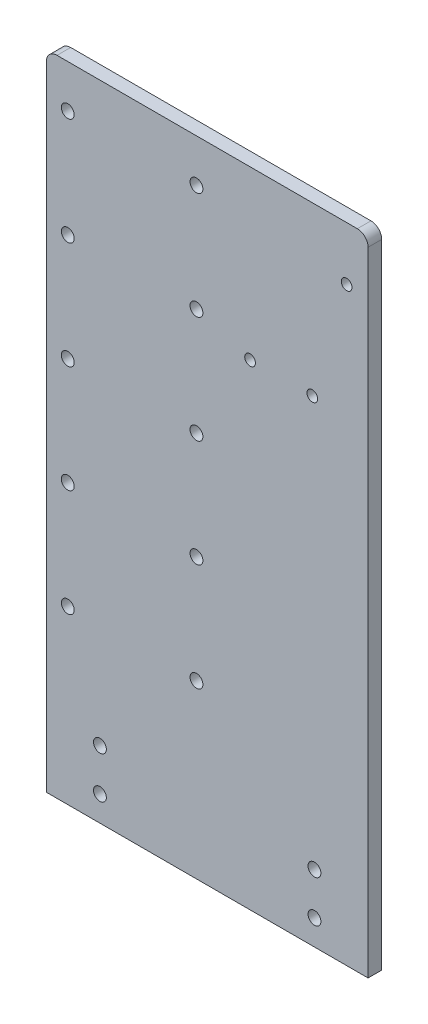
ISO-10303-21;
HEADER;
FILE_DESCRIPTION(('STEP AP214'),'2;1');
FILE_NAME('part.step','',(''),(''),'','','');
FILE_SCHEMA(('AUTOMOTIVE_DESIGN { 1 0 10303 214 1 1 1 1 }'));
ENDSEC;
DATA;
#1=APPLICATION_CONTEXT('core data for automotive mechanical design processes');
#2=APPLICATION_PROTOCOL_DEFINITION('international standard','automotive_design',2000,#1);
#3=PRODUCT_CONTEXT('',#1,'mechanical');
#4=PRODUCT('Part','Part','',(#3));
#5=PRODUCT_RELATED_PRODUCT_CATEGORY('part','',(#4));
#6=PRODUCT_DEFINITION_FORMATION('','',#4);
#7=PRODUCT_DEFINITION_CONTEXT('part definition',#1,'design');
#8=PRODUCT_DEFINITION('design','',#6,#7);
#9=PRODUCT_DEFINITION_SHAPE('','',#8);
#10=(LENGTH_UNIT() NAMED_UNIT(*) SI_UNIT(.MILLI.,.METRE.));
#11=(NAMED_UNIT(*) PLANE_ANGLE_UNIT() SI_UNIT($,.RADIAN.));
#12=(NAMED_UNIT(*) SI_UNIT($,.STERADIAN.) SOLID_ANGLE_UNIT());
#13=UNCERTAINTY_MEASURE_WITH_UNIT(LENGTH_MEASURE(1.E-05),#10,'distance_accuracy_value','');
#14=(GEOMETRIC_REPRESENTATION_CONTEXT(3) GLOBAL_UNCERTAINTY_ASSIGNED_CONTEXT((#13)) GLOBAL_UNIT_ASSIGNED_CONTEXT((#10,
#11,#12)) REPRESENTATION_CONTEXT('',''));
#15=CARTESIAN_POINT('',(0.,0.,0.));
#16=DIRECTION('',(0.,0.,1.));
#17=DIRECTION('',(1.,0.,0.));
#18=AXIS2_PLACEMENT_3D('',#15,#16,#17);
#19=CARTESIAN_POINT('',(-52.5112959769321,81.6237761299463,6.35));
#20=DIRECTION('',(1.,0.,0.));
#21=DIRECTION('',(0.,1.,0.));
#22=AXIS2_PLACEMENT_3D('',#19,#20,#21);
#23=PLANE('',#22);
#24=DIRECTION('',(0.,-1.,0.));
#25=VECTOR('',#24,1.);
#26=CARTESIAN_POINT('',(-52.5112959769321,81.6237761299463,6.35));
#27=LINE('',#26,#25);
#28=CARTESIAN_POINT('',(-52.5112959769321,76.6237761299463,6.35));
#29=VERTEX_POINT('',#28);
#30=CARTESIAN_POINT('',(-52.5112959769321,-218.376223870054,6.35));
#31=VERTEX_POINT('',#30);
#32=EDGE_CURVE('E85',#29,#31,#27,.T.);
#33=ORIENTED_EDGE('',*,*,#32,.F.);
#34=DIRECTION('',(0.,0.,-1.));
#35=VECTOR('',#34,1.);
#36=CARTESIAN_POINT('',(-52.5112959769321,76.6237761299463,6.35));
#37=LINE('',#36,#35);
#38=CARTESIAN_POINT('',(-52.5112959769321,76.6237761299463,0.));
#39=VERTEX_POINT('',#38);
#40=EDGE_CURVE('E11',#29,#39,#37,.T.);
#41=ORIENTED_EDGE('',*,*,#40,.T.);
#42=DIRECTION('',(0.,-1.,0.));
#43=VECTOR('',#42,1.);
#44=CARTESIAN_POINT('',(-52.5112959769321,81.6237761299463,0.));
#45=LINE('',#44,#43);
#46=CARTESIAN_POINT('',(-52.5112959769321,-218.376223870054,0.));
#47=VERTEX_POINT('',#46);
#48=EDGE_CURVE('E104',#39,#47,#45,.T.);
#49=ORIENTED_EDGE('',*,*,#48,.T.);
#50=DIRECTION('',(0.,0.,-1.));
#51=VECTOR('',#50,1.);
#52=CARTESIAN_POINT('',(-52.5112959769321,-218.376223870054,6.35));
#53=LINE('',#52,#51);
#54=EDGE_CURVE('E98',#31,#47,#53,.T.);
#55=ORIENTED_EDGE('',*,*,#54,.F.);
#56=EDGE_LOOP('',(#33,#41,#49,#55));
#57=FACE_BOUND('',#56,.T.);
#58=ADVANCED_FACE('F32',(#57),#23,.F.);
#59=CARTESIAN_POINT('',(-52.5112959769321,-218.376223870054,6.35));
#60=DIRECTION('',(0.,1.,0.));
#61=DIRECTION('',(0.,0.,1.));
#62=AXIS2_PLACEMENT_3D('',#59,#60,#61);
#63=PLANE('',#62);
#64=DIRECTION('',(1.,0.,0.));
#65=VECTOR('',#64,1.);
#66=CARTESIAN_POINT('',(-52.5112959769321,-218.376223870054,0.));
#67=LINE('',#66,#65);
#68=CARTESIAN_POINT('',(97.4887040230679,-218.376223870054,0.));
#69=VERTEX_POINT('',#68);
#70=EDGE_CURVE('E137',#47,#69,#67,.T.);
#71=ORIENTED_EDGE('',*,*,#70,.T.);
#72=DIRECTION('',(0.,0.,-1.));
#73=VECTOR('',#72,1.);
#74=CARTESIAN_POINT('',(97.4887040230679,-218.376223870054,6.35));
#75=LINE('',#74,#73);
#76=CARTESIAN_POINT('',(97.4887040230679,-218.376223870054,6.35));
#77=VERTEX_POINT('',#76);
#78=EDGE_CURVE('E100',#77,#69,#75,.T.);
#79=ORIENTED_EDGE('',*,*,#78,.F.);
#80=DIRECTION('',(1.,0.,0.));
#81=VECTOR('',#80,1.);
#82=CARTESIAN_POINT('',(-52.5112959769321,-218.376223870054,6.35));
#83=LINE('',#82,#81);
#84=EDGE_CURVE('E88',#31,#77,#83,.T.);
#85=ORIENTED_EDGE('',*,*,#84,.F.);
#86=ORIENTED_EDGE('',*,*,#54,.T.);
#87=EDGE_LOOP('',(#71,#79,#85,#86));
#88=FACE_BOUND('',#87,.T.);
#89=ADVANCED_FACE('F97',(#88),#63,.F.);
#90=CARTESIAN_POINT('',(97.4887040230678,81.6237761299463,6.35));
#91=DIRECTION('',(-1.,0.,0.));
#92=DIRECTION('',(0.,-1.,0.));
#93=AXIS2_PLACEMENT_3D('',#90,#91,#92);
#94=PLANE('',#93);
#95=DIRECTION('',(0.,1.,0.));
#96=VECTOR('',#95,1.);
#97=CARTESIAN_POINT('',(97.4887040230678,81.6237761299463,0.));
#98=LINE('',#97,#96);
#99=CARTESIAN_POINT('',(97.4887040230678,76.6237761299463,0.));
#100=VERTEX_POINT('',#99);
#101=EDGE_CURVE('E135',#69,#100,#98,.T.);
#102=ORIENTED_EDGE('',*,*,#101,.T.);
#103=DIRECTION('',(0.,0.,-1.));
#104=VECTOR('',#103,1.);
#105=CARTESIAN_POINT('',(97.4887040230678,76.6237761299463,6.35));
#106=LINE('',#105,#104);
#107=CARTESIAN_POINT('',(97.4887040230678,76.6237761299463,6.35));
#108=VERTEX_POINT('',#107);
#109=EDGE_CURVE('E55',#100,#108,#106,.F.);
#110=ORIENTED_EDGE('',*,*,#109,.T.);
#111=DIRECTION('',(0.,1.,0.));
#112=VECTOR('',#111,1.);
#113=CARTESIAN_POINT('',(97.4887040230678,81.6237761299463,6.35));
#114=LINE('',#113,#112);
#115=EDGE_CURVE('E101',#77,#108,#114,.T.);
#116=ORIENTED_EDGE('',*,*,#115,.F.);
#117=ORIENTED_EDGE('',*,*,#78,.T.);
#118=EDGE_LOOP('',(#102,#110,#116,#117));
#119=FACE_BOUND('',#118,.T.);
#120=ADVANCED_FACE('F136',(#119),#94,.F.);
#121=CARTESIAN_POINT('',(-52.5112959769321,81.6237761299463,6.35));
#122=DIRECTION('',(0.,-1.,0.));
#123=DIRECTION('',(0.,0.,-1.));
#124=AXIS2_PLACEMENT_3D('',#121,#122,#123);
#125=PLANE('',#124);
#126=DIRECTION('',(-1.,0.,0.));
#127=VECTOR('',#126,1.);
#128=CARTESIAN_POINT('',(-52.5112959769321,81.6237761299463,6.35));
#129=LINE('',#128,#127);
#130=CARTESIAN_POINT('',(92.4887040230678,81.6237761299463,6.35));
#131=VERTEX_POINT('',#130);
#132=CARTESIAN_POINT('',(-47.5112959769321,81.6237761299463,6.35));
#133=VERTEX_POINT('',#132);
#134=EDGE_CURVE('E110',#131,#133,#129,.T.);
#135=ORIENTED_EDGE('',*,*,#134,.F.);
#136=DIRECTION('',(0.,0.,-1.));
#137=VECTOR('',#136,1.);
#138=CARTESIAN_POINT('',(92.4887040230678,81.6237761299463,6.35));
#139=LINE('',#138,#137);
#140=CARTESIAN_POINT('',(92.4887040230678,81.6237761299463,0.));
#141=VERTEX_POINT('',#140);
#142=EDGE_CURVE('E108',#131,#141,#139,.T.);
#143=ORIENTED_EDGE('',*,*,#142,.T.);
#144=DIRECTION('',(-1.,0.,0.));
#145=VECTOR('',#144,1.);
#146=CARTESIAN_POINT('',(-52.5112959769321,81.6237761299463,0.));
#147=LINE('',#146,#145);
#148=CARTESIAN_POINT('',(-47.5112959769321,81.6237761299463,0.));
#149=VERTEX_POINT('',#148);
#150=EDGE_CURVE('E93',#141,#149,#147,.T.);
#151=ORIENTED_EDGE('',*,*,#150,.T.);
#152=DIRECTION('',(0.,0.,-1.));
#153=VECTOR('',#152,1.);
#154=CARTESIAN_POINT('',(-47.5112959769321,81.6237761299463,6.35));
#155=LINE('',#154,#153);
#156=EDGE_CURVE('E106',#149,#133,#155,.F.);
#157=ORIENTED_EDGE('',*,*,#156,.T.);
#158=EDGE_LOOP('',(#135,#143,#151,#157));
#159=FACE_BOUND('',#158,.T.);
#160=ADVANCED_FACE('F126',(#159),#125,.F.);
#161=CARTESIAN_POINT('',(0.,0.,6.35));
#162=DIRECTION('',(0.,0.,1.));
#163=DIRECTION('',(1.,0.,0.));
#164=AXIS2_PLACEMENT_3D('',#161,#162,#163);
#165=PLANE('',#164);
#166=CARTESIAN_POINT('',(17.4887040230679,61.6237761299463,6.35));
#167=DIRECTION('',(0.,0.,1.));
#168=DIRECTION('',(1.,0.,0.));
#169=AXIS2_PLACEMENT_3D('',#166,#167,#168);
#170=CIRCLE('',#169,3.);
#171=CARTESIAN_POINT('',(20.4887040230679,61.6237761299463,6.35));
#172=VERTEX_POINT('',#171);
#173=EDGE_CURVE('E240',#172,#172,#170,.T.);
#174=ORIENTED_EDGE('',*,*,#173,.F.);
#175=EDGE_LOOP('',(#174));
#176=FACE_BOUND('',#175,.T.);
#177=CARTESIAN_POINT('',(-42.5112959769321,61.6237761299463,6.35));
#178=DIRECTION('',(0.,0.,1.));
#179=DIRECTION('',(1.,0.,0.));
#180=AXIS2_PLACEMENT_3D('',#177,#178,#179);
#181=CIRCLE('',#180,3.);
#182=CARTESIAN_POINT('',(-39.5112959769321,61.6237761299463,6.35));
#183=VERTEX_POINT('',#182);
#184=EDGE_CURVE('E234',#183,#183,#181,.T.);
#185=ORIENTED_EDGE('',*,*,#184,.F.);
#186=EDGE_LOOP('',(#185));
#187=FACE_BOUND('',#186,.T.);
#188=CARTESIAN_POINT('',(17.4887040230679,11.6237761299463,6.35));
#189=DIRECTION('',(0.,0.,1.));
#190=DIRECTION('',(1.,0.,0.));
#191=AXIS2_PLACEMENT_3D('',#188,#189,#190);
#192=CIRCLE('',#191,3.);
#193=CARTESIAN_POINT('',(20.4887040230679,11.6237761299463,6.35));
#194=VERTEX_POINT('',#193);
#195=EDGE_CURVE('E228',#194,#194,#192,.T.);
#196=ORIENTED_EDGE('',*,*,#195,.F.);
#197=EDGE_LOOP('',(#196));
#198=FACE_BOUND('',#197,.T.);
#199=CARTESIAN_POINT('',(-42.5112959769321,11.6237761299463,6.35));
#200=DIRECTION('',(0.,0.,1.));
#201=DIRECTION('',(1.,0.,0.));
#202=AXIS2_PLACEMENT_3D('',#199,#200,#201);
#203=CIRCLE('',#202,3.);
#204=CARTESIAN_POINT('',(-39.5112959769321,11.6237761299463,6.35));
#205=VERTEX_POINT('',#204);
#206=EDGE_CURVE('E222',#205,#205,#203,.T.);
#207=ORIENTED_EDGE('',*,*,#206,.F.);
#208=EDGE_LOOP('',(#207));
#209=FACE_BOUND('',#208,.T.);
#210=CARTESIAN_POINT('',(17.4887040230679,-88.3762238700537,6.35));
#211=DIRECTION('',(0.,0.,1.));
#212=DIRECTION('',(1.,0.,0.));
#213=AXIS2_PLACEMENT_3D('',#210,#211,#212);
#214=CIRCLE('',#213,3.);
#215=CARTESIAN_POINT('',(20.4887040230679,-88.3762238700537,6.35));
#216=VERTEX_POINT('',#215);
#217=EDGE_CURVE('E216',#216,#216,#214,.T.);
#218=ORIENTED_EDGE('',*,*,#217,.F.);
#219=EDGE_LOOP('',(#218));
#220=FACE_BOUND('',#219,.T.);
#221=CARTESIAN_POINT('',(-42.5112959769321,-88.3762238700537,6.35));
#222=DIRECTION('',(0.,0.,1.));
#223=DIRECTION('',(1.,0.,0.));
#224=AXIS2_PLACEMENT_3D('',#221,#222,#223);
#225=CIRCLE('',#224,3.);
#226=CARTESIAN_POINT('',(-39.5112959769321,-88.3762238700537,6.35));
#227=VERTEX_POINT('',#226);
#228=EDGE_CURVE('E210',#227,#227,#225,.T.);
#229=ORIENTED_EDGE('',*,*,#228,.F.);
#230=EDGE_LOOP('',(#229));
#231=FACE_BOUND('',#230,.T.);
#232=CARTESIAN_POINT('',(17.4887040230679,-138.376223870054,6.35));
#233=DIRECTION('',(0.,0.,1.));
#234=DIRECTION('',(1.,0.,0.));
#235=AXIS2_PLACEMENT_3D('',#232,#233,#234);
#236=CIRCLE('',#235,3.);
#237=CARTESIAN_POINT('',(20.4887040230679,-138.376223870054,6.35));
#238=VERTEX_POINT('',#237);
#239=EDGE_CURVE('E204',#238,#238,#236,.T.);
#240=ORIENTED_EDGE('',*,*,#239,.F.);
#241=EDGE_LOOP('',(#240));
#242=FACE_BOUND('',#241,.T.);
#243=CARTESIAN_POINT('',(-42.5112959769321,-138.376223870054,6.35));
#244=DIRECTION('',(0.,0.,1.));
#245=DIRECTION('',(1.,0.,0.));
#246=AXIS2_PLACEMENT_3D('',#243,#244,#245);
#247=CIRCLE('',#246,3.);
#248=CARTESIAN_POINT('',(-39.5112959769321,-138.376223870054,6.35));
#249=VERTEX_POINT('',#248);
#250=EDGE_CURVE('E198',#249,#249,#247,.T.);
#251=ORIENTED_EDGE('',*,*,#250,.F.);
#252=EDGE_LOOP('',(#251));
#253=FACE_BOUND('',#252,.T.);
#254=CARTESIAN_POINT('',(17.4887040230679,-38.3762238700537,6.35));
#255=DIRECTION('',(0.,0.,1.));
#256=DIRECTION('',(1.,0.,0.));
#257=AXIS2_PLACEMENT_3D('',#254,#255,#256);
#258=CIRCLE('',#257,3.);
#259=CARTESIAN_POINT('',(20.4887040230679,-38.3762238700537,6.35));
#260=VERTEX_POINT('',#259);
#261=EDGE_CURVE('E192',#260,#260,#258,.T.);
#262=ORIENTED_EDGE('',*,*,#261,.F.);
#263=EDGE_LOOP('',(#262));
#264=FACE_BOUND('',#263,.T.);
#265=CARTESIAN_POINT('',(-42.5112959769321,-38.3762238700537,6.35));
#266=DIRECTION('',(0.,0.,1.));
#267=DIRECTION('',(1.,0.,0.));
#268=AXIS2_PLACEMENT_3D('',#265,#266,#267);
#269=CIRCLE('',#268,3.);
#270=CARTESIAN_POINT('',(-39.5112959769321,-38.3762238700537,6.35));
#271=VERTEX_POINT('',#270);
#272=EDGE_CURVE('E186',#271,#271,#269,.T.);
#273=ORIENTED_EDGE('',*,*,#272,.F.);
#274=EDGE_LOOP('',(#273));
#275=FACE_BOUND('',#274,.T.);
#276=CARTESIAN_POINT('',(87.4887040230679,56.6237761299463,6.35));
#277=DIRECTION('',(0.,0.,1.));
#278=DIRECTION('',(1.,0.,0.));
#279=AXIS2_PLACEMENT_3D('',#276,#277,#278);
#280=CIRCLE('',#279,2.50000000000001);
#281=CARTESIAN_POINT('',(89.9887040230679,56.6237761299463,6.35));
#282=VERTEX_POINT('',#281);
#283=EDGE_CURVE('E180',#282,#282,#280,.T.);
#284=ORIENTED_EDGE('',*,*,#283,.F.);
#285=EDGE_LOOP('',(#284));
#286=FACE_BOUND('',#285,.T.);
#287=CARTESIAN_POINT('',(71.4887040230679,3.6237761299463,6.35));
#288=DIRECTION('',(0.,0.,1.));
#289=DIRECTION('',(1.,0.,0.));
#290=AXIS2_PLACEMENT_3D('',#287,#288,#289);
#291=CIRCLE('',#290,2.49999999999999);
#292=CARTESIAN_POINT('',(73.9887040230679,3.6237761299463,6.35));
#293=VERTEX_POINT('',#292);
#294=EDGE_CURVE('E174',#293,#293,#291,.T.);
#295=ORIENTED_EDGE('',*,*,#294,.F.);
#296=EDGE_LOOP('',(#295));
#297=FACE_BOUND('',#296,.T.);
#298=CARTESIAN_POINT('',(42.4887040230679,3.6237761299463,6.35));
#299=DIRECTION('',(0.,0.,1.));
#300=DIRECTION('',(1.,0.,0.));
#301=AXIS2_PLACEMENT_3D('',#298,#299,#300);
#302=CIRCLE('',#301,2.5);
#303=CARTESIAN_POINT('',(44.9887040230679,3.6237761299463,6.35));
#304=VERTEX_POINT('',#303);
#305=EDGE_CURVE('E168',#304,#304,#302,.T.);
#306=ORIENTED_EDGE('',*,*,#305,.F.);
#307=EDGE_LOOP('',(#306));
#308=FACE_BOUND('',#307,.T.);
#309=CARTESIAN_POINT('',(72.4887040230679,-187.076223870054,6.35));
#310=DIRECTION('',(0.,0.,1.));
#311=DIRECTION('',(1.,0.,0.));
#312=AXIS2_PLACEMENT_3D('',#309,#310,#311);
#313=CIRCLE('',#312,3.00000000000001);
#314=CARTESIAN_POINT('',(75.4887040230679,-187.076223870054,6.35));
#315=VERTEX_POINT('',#314);
#316=EDGE_CURVE('E162',#315,#315,#313,.T.);
#317=ORIENTED_EDGE('',*,*,#316,.F.);
#318=EDGE_LOOP('',(#317));
#319=FACE_BOUND('',#318,.T.);
#320=CARTESIAN_POINT('',(72.4887040230679,-206.576223870054,6.35));
#321=DIRECTION('',(0.,0.,1.));
#322=DIRECTION('',(1.,0.,0.));
#323=AXIS2_PLACEMENT_3D('',#320,#321,#322);
#324=CIRCLE('',#323,3.00000000000001);
#325=CARTESIAN_POINT('',(75.4887040230679,-206.576223870054,6.35));
#326=VERTEX_POINT('',#325);
#327=EDGE_CURVE('E156',#326,#326,#324,.T.);
#328=ORIENTED_EDGE('',*,*,#327,.F.);
#329=EDGE_LOOP('',(#328));
#330=FACE_BOUND('',#329,.T.);
#331=CARTESIAN_POINT('',(-27.5112959769321,-187.076223870054,6.35));
#332=DIRECTION('',(0.,0.,1.));
#333=DIRECTION('',(1.,0.,0.));
#334=AXIS2_PLACEMENT_3D('',#331,#332,#333);
#335=CIRCLE('',#334,3.);
#336=CARTESIAN_POINT('',(-24.5112959769321,-187.076223870054,6.35));
#337=VERTEX_POINT('',#336);
#338=EDGE_CURVE('E150',#337,#337,#335,.T.);
#339=ORIENTED_EDGE('',*,*,#338,.F.);
#340=EDGE_LOOP('',(#339));
#341=FACE_BOUND('',#340,.T.);
#342=CARTESIAN_POINT('',(-27.5112959769321,-206.576223870054,6.35));
#343=DIRECTION('',(0.,0.,1.));
#344=DIRECTION('',(1.,0.,0.));
#345=AXIS2_PLACEMENT_3D('',#342,#343,#344);
#346=CIRCLE('',#345,3.);
#347=CARTESIAN_POINT('',(-24.5112959769321,-206.576223870054,6.35));
#348=VERTEX_POINT('',#347);
#349=EDGE_CURVE('E144',#348,#348,#346,.T.);
#350=ORIENTED_EDGE('',*,*,#349,.F.);
#351=EDGE_LOOP('',(#350));
#352=FACE_BOUND('',#351,.T.);
#353=ORIENTED_EDGE('',*,*,#115,.T.);
#354=CARTESIAN_POINT('',(92.4887040230678,76.6237761299463,6.35));
#355=DIRECTION('',(0.,0.,1.));
#356=DIRECTION('',(1.,0.,0.));
#357=AXIS2_PLACEMENT_3D('',#354,#355,#356);
#358=CIRCLE('',#357,5.);
#359=EDGE_CURVE('E40',#108,#131,#358,.T.);
#360=ORIENTED_EDGE('',*,*,#359,.T.);
#361=ORIENTED_EDGE('',*,*,#134,.T.);
#362=CARTESIAN_POINT('',(-47.5112959769321,76.6237761299463,6.35));
#363=DIRECTION('',(0.,0.,1.));
#364=DIRECTION('',(1.,0.,0.));
#365=AXIS2_PLACEMENT_3D('',#362,#363,#364);
#366=CIRCLE('',#365,5.);
#367=EDGE_CURVE('E47',#133,#29,#366,.T.);
#368=ORIENTED_EDGE('',*,*,#367,.T.);
#369=ORIENTED_EDGE('',*,*,#32,.T.);
#370=ORIENTED_EDGE('',*,*,#84,.T.);
#371=EDGE_LOOP('',(#353,#360,#361,#368,#369,#370));
#372=FACE_BOUND('',#371,.T.);
#373=ADVANCED_FACE('F87',(#176,#187,#198,#209,#220,#231,#242,#253,#264,#275,#286,#297,#308,#319,
#330,#341,#352,#372),#165,.T.);
#374=CARTESIAN_POINT('',(0.,0.,0.));
#375=DIRECTION('',(0.,0.,1.));
#376=DIRECTION('',(1.,0.,0.));
#377=AXIS2_PLACEMENT_3D('',#374,#375,#376);
#378=PLANE('',#377);
#379=CARTESIAN_POINT('',(17.4887040230679,61.6237761299463,0.));
#380=DIRECTION('',(0.,0.,1.));
#381=DIRECTION('',(1.,0.,0.));
#382=AXIS2_PLACEMENT_3D('',#379,#380,#381);
#383=CIRCLE('',#382,3.);
#384=CARTESIAN_POINT('',(20.4887040230679,61.6237761299463,0.));
#385=VERTEX_POINT('',#384);
#386=EDGE_CURVE('E237',#385,#385,#383,.T.);
#387=ORIENTED_EDGE('',*,*,#386,.T.);
#388=EDGE_LOOP('',(#387));
#389=FACE_BOUND('',#388,.T.);
#390=CARTESIAN_POINT('',(-42.5112959769321,61.6237761299463,0.));
#391=DIRECTION('',(0.,0.,1.));
#392=DIRECTION('',(1.,0.,0.));
#393=AXIS2_PLACEMENT_3D('',#390,#391,#392);
#394=CIRCLE('',#393,3.);
#395=CARTESIAN_POINT('',(-39.5112959769321,61.6237761299463,0.));
#396=VERTEX_POINT('',#395);
#397=EDGE_CURVE('E231',#396,#396,#394,.T.);
#398=ORIENTED_EDGE('',*,*,#397,.T.);
#399=EDGE_LOOP('',(#398));
#400=FACE_BOUND('',#399,.T.);
#401=CARTESIAN_POINT('',(17.4887040230679,11.6237761299463,0.));
#402=DIRECTION('',(0.,0.,1.));
#403=DIRECTION('',(1.,0.,0.));
#404=AXIS2_PLACEMENT_3D('',#401,#402,#403);
#405=CIRCLE('',#404,3.);
#406=CARTESIAN_POINT('',(20.4887040230679,11.6237761299463,0.));
#407=VERTEX_POINT('',#406);
#408=EDGE_CURVE('E225',#407,#407,#405,.T.);
#409=ORIENTED_EDGE('',*,*,#408,.T.);
#410=EDGE_LOOP('',(#409));
#411=FACE_BOUND('',#410,.T.);
#412=CARTESIAN_POINT('',(-42.5112959769321,11.6237761299463,0.));
#413=DIRECTION('',(0.,0.,1.));
#414=DIRECTION('',(1.,0.,0.));
#415=AXIS2_PLACEMENT_3D('',#412,#413,#414);
#416=CIRCLE('',#415,3.);
#417=CARTESIAN_POINT('',(-39.5112959769321,11.6237761299463,0.));
#418=VERTEX_POINT('',#417);
#419=EDGE_CURVE('E219',#418,#418,#416,.T.);
#420=ORIENTED_EDGE('',*,*,#419,.T.);
#421=EDGE_LOOP('',(#420));
#422=FACE_BOUND('',#421,.T.);
#423=CARTESIAN_POINT('',(17.4887040230679,-88.3762238700537,0.));
#424=DIRECTION('',(0.,0.,1.));
#425=DIRECTION('',(1.,0.,0.));
#426=AXIS2_PLACEMENT_3D('',#423,#424,#425);
#427=CIRCLE('',#426,3.);
#428=CARTESIAN_POINT('',(20.4887040230679,-88.3762238700537,0.));
#429=VERTEX_POINT('',#428);
#430=EDGE_CURVE('E213',#429,#429,#427,.T.);
#431=ORIENTED_EDGE('',*,*,#430,.T.);
#432=EDGE_LOOP('',(#431));
#433=FACE_BOUND('',#432,.T.);
#434=CARTESIAN_POINT('',(-42.5112959769321,-88.3762238700537,0.));
#435=DIRECTION('',(0.,0.,1.));
#436=DIRECTION('',(1.,0.,0.));
#437=AXIS2_PLACEMENT_3D('',#434,#435,#436);
#438=CIRCLE('',#437,3.);
#439=CARTESIAN_POINT('',(-39.5112959769321,-88.3762238700537,0.));
#440=VERTEX_POINT('',#439);
#441=EDGE_CURVE('E207',#440,#440,#438,.T.);
#442=ORIENTED_EDGE('',*,*,#441,.T.);
#443=EDGE_LOOP('',(#442));
#444=FACE_BOUND('',#443,.T.);
#445=CARTESIAN_POINT('',(17.4887040230679,-138.376223870054,0.));
#446=DIRECTION('',(0.,0.,1.));
#447=DIRECTION('',(1.,0.,0.));
#448=AXIS2_PLACEMENT_3D('',#445,#446,#447);
#449=CIRCLE('',#448,3.);
#450=CARTESIAN_POINT('',(20.4887040230679,-138.376223870054,0.));
#451=VERTEX_POINT('',#450);
#452=EDGE_CURVE('E201',#451,#451,#449,.T.);
#453=ORIENTED_EDGE('',*,*,#452,.T.);
#454=EDGE_LOOP('',(#453));
#455=FACE_BOUND('',#454,.T.);
#456=CARTESIAN_POINT('',(-42.5112959769321,-138.376223870054,0.));
#457=DIRECTION('',(0.,0.,1.));
#458=DIRECTION('',(1.,0.,0.));
#459=AXIS2_PLACEMENT_3D('',#456,#457,#458);
#460=CIRCLE('',#459,3.);
#461=CARTESIAN_POINT('',(-39.5112959769321,-138.376223870054,0.));
#462=VERTEX_POINT('',#461);
#463=EDGE_CURVE('E195',#462,#462,#460,.T.);
#464=ORIENTED_EDGE('',*,*,#463,.T.);
#465=EDGE_LOOP('',(#464));
#466=FACE_BOUND('',#465,.T.);
#467=CARTESIAN_POINT('',(17.4887040230679,-38.3762238700537,0.));
#468=DIRECTION('',(0.,0.,1.));
#469=DIRECTION('',(1.,0.,0.));
#470=AXIS2_PLACEMENT_3D('',#467,#468,#469);
#471=CIRCLE('',#470,3.);
#472=CARTESIAN_POINT('',(20.4887040230679,-38.3762238700537,0.));
#473=VERTEX_POINT('',#472);
#474=EDGE_CURVE('E189',#473,#473,#471,.T.);
#475=ORIENTED_EDGE('',*,*,#474,.T.);
#476=EDGE_LOOP('',(#475));
#477=FACE_BOUND('',#476,.T.);
#478=CARTESIAN_POINT('',(-42.5112959769321,-38.3762238700537,0.));
#479=DIRECTION('',(0.,0.,1.));
#480=DIRECTION('',(1.,0.,0.));
#481=AXIS2_PLACEMENT_3D('',#478,#479,#480);
#482=CIRCLE('',#481,3.);
#483=CARTESIAN_POINT('',(-39.5112959769321,-38.3762238700537,0.));
#484=VERTEX_POINT('',#483);
#485=EDGE_CURVE('E183',#484,#484,#482,.T.);
#486=ORIENTED_EDGE('',*,*,#485,.T.);
#487=EDGE_LOOP('',(#486));
#488=FACE_BOUND('',#487,.T.);
#489=CARTESIAN_POINT('',(87.4887040230679,56.6237761299463,0.));
#490=DIRECTION('',(0.,0.,1.));
#491=DIRECTION('',(1.,0.,0.));
#492=AXIS2_PLACEMENT_3D('',#489,#490,#491);
#493=CIRCLE('',#492,2.50000000000001);
#494=CARTESIAN_POINT('',(89.9887040230679,56.6237761299463,0.));
#495=VERTEX_POINT('',#494);
#496=EDGE_CURVE('E177',#495,#495,#493,.T.);
#497=ORIENTED_EDGE('',*,*,#496,.T.);
#498=EDGE_LOOP('',(#497));
#499=FACE_BOUND('',#498,.T.);
#500=CARTESIAN_POINT('',(71.4887040230679,3.6237761299463,0.));
#501=DIRECTION('',(0.,0.,1.));
#502=DIRECTION('',(1.,0.,0.));
#503=AXIS2_PLACEMENT_3D('',#500,#501,#502);
#504=CIRCLE('',#503,2.49999999999999);
#505=CARTESIAN_POINT('',(73.9887040230679,3.6237761299463,0.));
#506=VERTEX_POINT('',#505);
#507=EDGE_CURVE('E171',#506,#506,#504,.T.);
#508=ORIENTED_EDGE('',*,*,#507,.T.);
#509=EDGE_LOOP('',(#508));
#510=FACE_BOUND('',#509,.T.);
#511=CARTESIAN_POINT('',(42.4887040230679,3.6237761299463,0.));
#512=DIRECTION('',(0.,0.,1.));
#513=DIRECTION('',(1.,0.,0.));
#514=AXIS2_PLACEMENT_3D('',#511,#512,#513);
#515=CIRCLE('',#514,2.5);
#516=CARTESIAN_POINT('',(44.9887040230679,3.6237761299463,0.));
#517=VERTEX_POINT('',#516);
#518=EDGE_CURVE('E165',#517,#517,#515,.T.);
#519=ORIENTED_EDGE('',*,*,#518,.T.);
#520=EDGE_LOOP('',(#519));
#521=FACE_BOUND('',#520,.T.);
#522=CARTESIAN_POINT('',(72.4887040230679,-187.076223870054,0.));
#523=DIRECTION('',(0.,0.,1.));
#524=DIRECTION('',(1.,0.,0.));
#525=AXIS2_PLACEMENT_3D('',#522,#523,#524);
#526=CIRCLE('',#525,3.00000000000001);
#527=CARTESIAN_POINT('',(75.4887040230679,-187.076223870054,0.));
#528=VERTEX_POINT('',#527);
#529=EDGE_CURVE('E159',#528,#528,#526,.T.);
#530=ORIENTED_EDGE('',*,*,#529,.T.);
#531=EDGE_LOOP('',(#530));
#532=FACE_BOUND('',#531,.T.);
#533=CARTESIAN_POINT('',(72.4887040230679,-206.576223870054,0.));
#534=DIRECTION('',(0.,0.,1.));
#535=DIRECTION('',(1.,0.,0.));
#536=AXIS2_PLACEMENT_3D('',#533,#534,#535);
#537=CIRCLE('',#536,3.00000000000001);
#538=CARTESIAN_POINT('',(75.4887040230679,-206.576223870054,0.));
#539=VERTEX_POINT('',#538);
#540=EDGE_CURVE('E153',#539,#539,#537,.T.);
#541=ORIENTED_EDGE('',*,*,#540,.T.);
#542=EDGE_LOOP('',(#541));
#543=FACE_BOUND('',#542,.T.);
#544=CARTESIAN_POINT('',(-27.5112959769321,-187.076223870054,0.));
#545=DIRECTION('',(0.,0.,1.));
#546=DIRECTION('',(1.,0.,0.));
#547=AXIS2_PLACEMENT_3D('',#544,#545,#546);
#548=CIRCLE('',#547,3.);
#549=CARTESIAN_POINT('',(-24.5112959769321,-187.076223870054,0.));
#550=VERTEX_POINT('',#549);
#551=EDGE_CURVE('E147',#550,#550,#548,.T.);
#552=ORIENTED_EDGE('',*,*,#551,.T.);
#553=EDGE_LOOP('',(#552));
#554=FACE_BOUND('',#553,.T.);
#555=CARTESIAN_POINT('',(-27.5112959769321,-206.576223870054,0.));
#556=DIRECTION('',(0.,0.,1.));
#557=DIRECTION('',(1.,0.,0.));
#558=AXIS2_PLACEMENT_3D('',#555,#556,#557);
#559=CIRCLE('',#558,3.);
#560=CARTESIAN_POINT('',(-24.5112959769321,-206.576223870054,0.));
#561=VERTEX_POINT('',#560);
#562=EDGE_CURVE('E141',#561,#561,#559,.T.);
#563=ORIENTED_EDGE('',*,*,#562,.T.);
#564=EDGE_LOOP('',(#563));
#565=FACE_BOUND('',#564,.T.);
#566=ORIENTED_EDGE('',*,*,#150,.F.);
#567=CARTESIAN_POINT('',(92.4887040230678,76.6237761299463,0.));
#568=DIRECTION('',(0.,0.,1.));
#569=DIRECTION('',(1.,0.,0.));
#570=AXIS2_PLACEMENT_3D('',#567,#568,#569);
#571=CIRCLE('',#570,5.);
#572=EDGE_CURVE('E118',#141,#100,#571,.F.);
#573=ORIENTED_EDGE('',*,*,#572,.T.);
#574=ORIENTED_EDGE('',*,*,#101,.F.);
#575=ORIENTED_EDGE('',*,*,#70,.F.);
#576=ORIENTED_EDGE('',*,*,#48,.F.);
#577=CARTESIAN_POINT('',(-47.5112959769321,76.6237761299463,0.));
#578=DIRECTION('',(0.,0.,1.));
#579=DIRECTION('',(1.,0.,0.));
#580=AXIS2_PLACEMENT_3D('',#577,#578,#579);
#581=CIRCLE('',#580,5.);
#582=EDGE_CURVE('E116',#39,#149,#581,.F.);
#583=ORIENTED_EDGE('',*,*,#582,.T.);
#584=EDGE_LOOP('',(#566,#573,#574,#575,#576,#583));
#585=FACE_BOUND('',#584,.T.);
#586=ADVANCED_FACE('F134',(#389,#400,#411,#422,#433,#444,#455,#466,#477,#488,#499,#510,#521,
#532,#543,#554,#565,#585),#378,.F.);
#587=CARTESIAN_POINT('',(-27.5112959769321,-206.576223870054,0.));
#588=DIRECTION('',(0.,0.,1.));
#589=DIRECTION('',(1.,0.,0.));
#590=AXIS2_PLACEMENT_3D('',#587,#588,#589);
#591=CYLINDRICAL_SURFACE('',#590,3.);
#592=ORIENTED_EDGE('',*,*,#562,.F.);
#593=EDGE_LOOP('',(#592));
#594=FACE_BOUND('',#593,.T.);
#595=ORIENTED_EDGE('',*,*,#349,.T.);
#596=EDGE_LOOP('',(#595));
#597=FACE_BOUND('',#596,.T.);
#598=ADVANCED_FACE('F290',(#594,#597),#591,.F.);
#599=CARTESIAN_POINT('',(-27.5112959769321,-187.076223870054,0.));
#600=DIRECTION('',(0.,0.,1.));
#601=DIRECTION('',(1.,0.,0.));
#602=AXIS2_PLACEMENT_3D('',#599,#600,#601);
#603=CYLINDRICAL_SURFACE('',#602,3.);
#604=ORIENTED_EDGE('',*,*,#551,.F.);
#605=EDGE_LOOP('',(#604));
#606=FACE_BOUND('',#605,.T.);
#607=ORIENTED_EDGE('',*,*,#338,.T.);
#608=EDGE_LOOP('',(#607));
#609=FACE_BOUND('',#608,.T.);
#610=ADVANCED_FACE('F292',(#606,#609),#603,.F.);
#611=CARTESIAN_POINT('',(72.4887040230679,-206.576223870054,0.));
#612=DIRECTION('',(0.,0.,1.));
#613=DIRECTION('',(1.,0.,0.));
#614=AXIS2_PLACEMENT_3D('',#611,#612,#613);
#615=CYLINDRICAL_SURFACE('',#614,3.00000000000001);
#616=ORIENTED_EDGE('',*,*,#540,.F.);
#617=EDGE_LOOP('',(#616));
#618=FACE_BOUND('',#617,.T.);
#619=ORIENTED_EDGE('',*,*,#327,.T.);
#620=EDGE_LOOP('',(#619));
#621=FACE_BOUND('',#620,.T.);
#622=ADVANCED_FACE('F299',(#618,#621),#615,.F.);
#623=CARTESIAN_POINT('',(72.4887040230679,-187.076223870054,0.));
#624=DIRECTION('',(0.,0.,1.));
#625=DIRECTION('',(1.,0.,0.));
#626=AXIS2_PLACEMENT_3D('',#623,#624,#625);
#627=CYLINDRICAL_SURFACE('',#626,3.00000000000001);
#628=ORIENTED_EDGE('',*,*,#529,.F.);
#629=EDGE_LOOP('',(#628));
#630=FACE_BOUND('',#629,.T.);
#631=ORIENTED_EDGE('',*,*,#316,.T.);
#632=EDGE_LOOP('',(#631));
#633=FACE_BOUND('',#632,.T.);
#634=ADVANCED_FACE('F374',(#630,#633),#627,.F.);
#635=CARTESIAN_POINT('',(42.4887040230679,3.6237761299463,0.));
#636=DIRECTION('',(0.,0.,1.));
#637=DIRECTION('',(1.,0.,0.));
#638=AXIS2_PLACEMENT_3D('',#635,#636,#637);
#639=CYLINDRICAL_SURFACE('',#638,2.5);
#640=ORIENTED_EDGE('',*,*,#518,.F.);
#641=EDGE_LOOP('',(#640));
#642=FACE_BOUND('',#641,.T.);
#643=ORIENTED_EDGE('',*,*,#305,.T.);
#644=EDGE_LOOP('',(#643));
#645=FACE_BOUND('',#644,.T.);
#646=ADVANCED_FACE('F384',(#642,#645),#639,.F.);
#647=CARTESIAN_POINT('',(71.4887040230679,3.6237761299463,0.));
#648=DIRECTION('',(0.,0.,1.));
#649=DIRECTION('',(1.,0.,0.));
#650=AXIS2_PLACEMENT_3D('',#647,#648,#649);
#651=CYLINDRICAL_SURFACE('',#650,2.49999999999999);
#652=ORIENTED_EDGE('',*,*,#507,.F.);
#653=EDGE_LOOP('',(#652));
#654=FACE_BOUND('',#653,.T.);
#655=ORIENTED_EDGE('',*,*,#294,.T.);
#656=EDGE_LOOP('',(#655));
#657=FACE_BOUND('',#656,.T.);
#658=ADVANCED_FACE('F394',(#654,#657),#651,.F.);
#659=CARTESIAN_POINT('',(87.4887040230679,56.6237761299463,0.));
#660=DIRECTION('',(0.,0.,1.));
#661=DIRECTION('',(1.,0.,0.));
#662=AXIS2_PLACEMENT_3D('',#659,#660,#661);
#663=CYLINDRICAL_SURFACE('',#662,2.50000000000001);
#664=ORIENTED_EDGE('',*,*,#496,.F.);
#665=EDGE_LOOP('',(#664));
#666=FACE_BOUND('',#665,.T.);
#667=ORIENTED_EDGE('',*,*,#283,.T.);
#668=EDGE_LOOP('',(#667));
#669=FACE_BOUND('',#668,.T.);
#670=ADVANCED_FACE('F404',(#666,#669),#663,.F.);
#671=CARTESIAN_POINT('',(-42.5112959769321,-38.3762238700537,0.));
#672=DIRECTION('',(0.,0.,1.));
#673=DIRECTION('',(1.,0.,0.));
#674=AXIS2_PLACEMENT_3D('',#671,#672,#673);
#675=CYLINDRICAL_SURFACE('',#674,3.);
#676=ORIENTED_EDGE('',*,*,#485,.F.);
#677=EDGE_LOOP('',(#676));
#678=FACE_BOUND('',#677,.T.);
#679=ORIENTED_EDGE('',*,*,#272,.T.);
#680=EDGE_LOOP('',(#679));
#681=FACE_BOUND('',#680,.T.);
#682=ADVANCED_FACE('F414',(#678,#681),#675,.F.);
#683=CARTESIAN_POINT('',(17.4887040230679,-38.3762238700537,0.));
#684=DIRECTION('',(0.,0.,1.));
#685=DIRECTION('',(1.,0.,0.));
#686=AXIS2_PLACEMENT_3D('',#683,#684,#685);
#687=CYLINDRICAL_SURFACE('',#686,3.);
#688=ORIENTED_EDGE('',*,*,#474,.F.);
#689=EDGE_LOOP('',(#688));
#690=FACE_BOUND('',#689,.T.);
#691=ORIENTED_EDGE('',*,*,#261,.T.);
#692=EDGE_LOOP('',(#691));
#693=FACE_BOUND('',#692,.T.);
#694=ADVANCED_FACE('F424',(#690,#693),#687,.F.);
#695=CARTESIAN_POINT('',(-42.5112959769321,-138.376223870054,0.));
#696=DIRECTION('',(0.,0.,1.));
#697=DIRECTION('',(1.,0.,0.));
#698=AXIS2_PLACEMENT_3D('',#695,#696,#697);
#699=CYLINDRICAL_SURFACE('',#698,3.);
#700=ORIENTED_EDGE('',*,*,#463,.F.);
#701=EDGE_LOOP('',(#700));
#702=FACE_BOUND('',#701,.T.);
#703=ORIENTED_EDGE('',*,*,#250,.T.);
#704=EDGE_LOOP('',(#703));
#705=FACE_BOUND('',#704,.T.);
#706=ADVANCED_FACE('F434',(#702,#705),#699,.F.);
#707=CARTESIAN_POINT('',(17.4887040230679,-138.376223870054,0.));
#708=DIRECTION('',(0.,0.,1.));
#709=DIRECTION('',(1.,0.,0.));
#710=AXIS2_PLACEMENT_3D('',#707,#708,#709);
#711=CYLINDRICAL_SURFACE('',#710,3.);
#712=ORIENTED_EDGE('',*,*,#452,.F.);
#713=EDGE_LOOP('',(#712));
#714=FACE_BOUND('',#713,.T.);
#715=ORIENTED_EDGE('',*,*,#239,.T.);
#716=EDGE_LOOP('',(#715));
#717=FACE_BOUND('',#716,.T.);
#718=ADVANCED_FACE('F444',(#714,#717),#711,.F.);
#719=CARTESIAN_POINT('',(-42.5112959769321,-88.3762238700537,0.));
#720=DIRECTION('',(0.,0.,1.));
#721=DIRECTION('',(1.,0.,0.));
#722=AXIS2_PLACEMENT_3D('',#719,#720,#721);
#723=CYLINDRICAL_SURFACE('',#722,3.);
#724=ORIENTED_EDGE('',*,*,#441,.F.);
#725=EDGE_LOOP('',(#724));
#726=FACE_BOUND('',#725,.T.);
#727=ORIENTED_EDGE('',*,*,#228,.T.);
#728=EDGE_LOOP('',(#727));
#729=FACE_BOUND('',#728,.T.);
#730=ADVANCED_FACE('F454',(#726,#729),#723,.F.);
#731=CARTESIAN_POINT('',(17.4887040230679,-88.3762238700537,0.));
#732=DIRECTION('',(0.,0.,1.));
#733=DIRECTION('',(1.,0.,0.));
#734=AXIS2_PLACEMENT_3D('',#731,#732,#733);
#735=CYLINDRICAL_SURFACE('',#734,3.);
#736=ORIENTED_EDGE('',*,*,#430,.F.);
#737=EDGE_LOOP('',(#736));
#738=FACE_BOUND('',#737,.T.);
#739=ORIENTED_EDGE('',*,*,#217,.T.);
#740=EDGE_LOOP('',(#739));
#741=FACE_BOUND('',#740,.T.);
#742=ADVANCED_FACE('F464',(#738,#741),#735,.F.);
#743=CARTESIAN_POINT('',(-42.5112959769321,11.6237761299463,0.));
#744=DIRECTION('',(0.,0.,1.));
#745=DIRECTION('',(1.,0.,0.));
#746=AXIS2_PLACEMENT_3D('',#743,#744,#745);
#747=CYLINDRICAL_SURFACE('',#746,3.);
#748=ORIENTED_EDGE('',*,*,#419,.F.);
#749=EDGE_LOOP('',(#748));
#750=FACE_BOUND('',#749,.T.);
#751=ORIENTED_EDGE('',*,*,#206,.T.);
#752=EDGE_LOOP('',(#751));
#753=FACE_BOUND('',#752,.T.);
#754=ADVANCED_FACE('F474',(#750,#753),#747,.F.);
#755=CARTESIAN_POINT('',(17.4887040230679,11.6237761299463,0.));
#756=DIRECTION('',(0.,0.,1.));
#757=DIRECTION('',(1.,0.,0.));
#758=AXIS2_PLACEMENT_3D('',#755,#756,#757);
#759=CYLINDRICAL_SURFACE('',#758,3.);
#760=ORIENTED_EDGE('',*,*,#408,.F.);
#761=EDGE_LOOP('',(#760));
#762=FACE_BOUND('',#761,.T.);
#763=ORIENTED_EDGE('',*,*,#195,.T.);
#764=EDGE_LOOP('',(#763));
#765=FACE_BOUND('',#764,.T.);
#766=ADVANCED_FACE('F484',(#762,#765),#759,.F.);
#767=CARTESIAN_POINT('',(-42.5112959769321,61.6237761299463,0.));
#768=DIRECTION('',(0.,0.,1.));
#769=DIRECTION('',(1.,0.,0.));
#770=AXIS2_PLACEMENT_3D('',#767,#768,#769);
#771=CYLINDRICAL_SURFACE('',#770,3.);
#772=ORIENTED_EDGE('',*,*,#397,.F.);
#773=EDGE_LOOP('',(#772));
#774=FACE_BOUND('',#773,.T.);
#775=ORIENTED_EDGE('',*,*,#184,.T.);
#776=EDGE_LOOP('',(#775));
#777=FACE_BOUND('',#776,.T.);
#778=ADVANCED_FACE('F251',(#774,#777),#771,.F.);
#779=CARTESIAN_POINT('',(17.4887040230679,61.6237761299463,0.));
#780=DIRECTION('',(0.,0.,1.));
#781=DIRECTION('',(1.,0.,0.));
#782=AXIS2_PLACEMENT_3D('',#779,#780,#781);
#783=CYLINDRICAL_SURFACE('',#782,3.);
#784=ORIENTED_EDGE('',*,*,#386,.F.);
#785=EDGE_LOOP('',(#784));
#786=FACE_BOUND('',#785,.T.);
#787=ORIENTED_EDGE('',*,*,#173,.T.);
#788=EDGE_LOOP('',(#787));
#789=FACE_BOUND('',#788,.T.);
#790=ADVANCED_FACE('F248',(#786,#789),#783,.F.);
#791=CARTESIAN_POINT('',(92.4887040230678,76.6237761299463,6.35));
#792=DIRECTION('',(0.,0.,-1.));
#793=DIRECTION('',(-1.,0.,0.));
#794=AXIS2_PLACEMENT_3D('',#791,#792,#793);
#795=CYLINDRICAL_SURFACE('',#794,5.);
#796=ORIENTED_EDGE('',*,*,#359,.F.);
#797=ORIENTED_EDGE('',*,*,#109,.F.);
#798=ORIENTED_EDGE('',*,*,#572,.F.);
#799=ORIENTED_EDGE('',*,*,#142,.F.);
#800=EDGE_LOOP('',(#796,#797,#798,#799));
#801=FACE_BOUND('',#800,.T.);
#802=ADVANCED_FACE('F131',(#801),#795,.T.);
#803=CARTESIAN_POINT('',(-47.5112959769321,76.6237761299463,6.35));
#804=DIRECTION('',(0.,0.,-1.));
#805=DIRECTION('',(-1.,0.,0.));
#806=AXIS2_PLACEMENT_3D('',#803,#804,#805);
#807=CYLINDRICAL_SURFACE('',#806,5.);
#808=ORIENTED_EDGE('',*,*,#367,.F.);
#809=ORIENTED_EDGE('',*,*,#156,.F.);
#810=ORIENTED_EDGE('',*,*,#582,.F.);
#811=ORIENTED_EDGE('',*,*,#40,.F.);
#812=EDGE_LOOP('',(#808,#809,#810,#811));
#813=FACE_BOUND('',#812,.T.);
#814=ADVANCED_FACE('F34',(#813),#807,.T.);
#815=CLOSED_SHELL('',(#58,#89,#120,#160,#373,#586,#598,#610,#622,#634,#646,#658,#670,#682,#694,
#706,#718,#730,#742,#754,#766,#778,#790,#802,#814));
#816=MANIFOLD_SOLID_BREP('B2',#815);
#817=ADVANCED_BREP_SHAPE_REPRESENTATION('',(#18,#816),#14);
#818=SHAPE_DEFINITION_REPRESENTATION(#9,#817);
ENDSEC;
END-ISO-10303-21;
